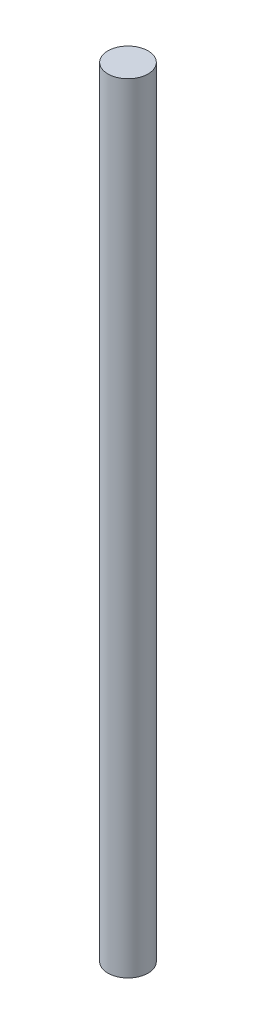
ISO-10303-21;
HEADER;
FILE_DESCRIPTION(('STEP AP214'),'2;1');
FILE_NAME('part.step','',(''),(''),'','','');
FILE_SCHEMA(('AUTOMOTIVE_DESIGN { 1 0 10303 214 1 1 1 1 }'));
ENDSEC;
DATA;
#1=APPLICATION_CONTEXT('core data for automotive mechanical design processes');
#2=APPLICATION_PROTOCOL_DEFINITION('international standard','automotive_design',2000,#1);
#3=PRODUCT_CONTEXT('',#1,'mechanical');
#4=PRODUCT('Part','Part','',(#3));
#5=PRODUCT_RELATED_PRODUCT_CATEGORY('part','',(#4));
#6=PRODUCT_DEFINITION_FORMATION('','',#4);
#7=PRODUCT_DEFINITION_CONTEXT('part definition',#1,'design');
#8=PRODUCT_DEFINITION('design','',#6,#7);
#9=PRODUCT_DEFINITION_SHAPE('','',#8);
#10=(LENGTH_UNIT() NAMED_UNIT(*) SI_UNIT(.MILLI.,.METRE.));
#11=(NAMED_UNIT(*) PLANE_ANGLE_UNIT() SI_UNIT($,.RADIAN.));
#12=(NAMED_UNIT(*) SI_UNIT($,.STERADIAN.) SOLID_ANGLE_UNIT());
#13=UNCERTAINTY_MEASURE_WITH_UNIT(LENGTH_MEASURE(1.E-05),#10,'distance_accuracy_value','');
#14=(GEOMETRIC_REPRESENTATION_CONTEXT(3) GLOBAL_UNCERTAINTY_ASSIGNED_CONTEXT((#13)) GLOBAL_UNIT_ASSIGNED_CONTEXT((#10,
#11,#12)) REPRESENTATION_CONTEXT('',''));
#15=CARTESIAN_POINT('',(0.,0.,0.));
#16=DIRECTION('',(0.,0.,1.));
#17=DIRECTION('',(1.,0.,0.));
#18=AXIS2_PLACEMENT_3D('',#15,#16,#17);
#19=CARTESIAN_POINT('',(0.,262.,0.));
#20=DIRECTION('',(0.,-1.,0.));
#21=DIRECTION('',(0.,0.,-1.));
#22=AXIS2_PLACEMENT_3D('',#19,#20,#21);
#23=CYLINDRICAL_SURFACE('',#22,6.75);
#24=CARTESIAN_POINT('',(0.,262.,0.));
#25=DIRECTION('',(0.,1.,0.));
#26=DIRECTION('',(0.,0.,1.));
#27=AXIS2_PLACEMENT_3D('',#24,#25,#26);
#28=CIRCLE('',#27,6.75);
#29=CARTESIAN_POINT('',(0.,262.,6.75));
#30=VERTEX_POINT('',#29);
#31=EDGE_CURVE('E10',#30,#30,#28,.T.);
#32=ORIENTED_EDGE('',*,*,#31,.F.);
#33=EDGE_LOOP('',(#32));
#34=FACE_BOUND('',#33,.T.);
#35=CARTESIAN_POINT('',(0.,0.,0.));
#36=DIRECTION('',(0.,1.,0.));
#37=DIRECTION('',(0.,0.,1.));
#38=AXIS2_PLACEMENT_3D('',#35,#36,#37);
#39=CIRCLE('',#38,6.75);
#40=CARTESIAN_POINT('',(0.,0.,6.75));
#41=VERTEX_POINT('',#40);
#42=EDGE_CURVE('E40',#41,#41,#39,.T.);
#43=ORIENTED_EDGE('',*,*,#42,.T.);
#44=EDGE_LOOP('',(#43));
#45=FACE_BOUND('',#44,.T.);
#46=ADVANCED_FACE('F37',(#34,#45),#23,.T.);
#47=CARTESIAN_POINT('',(0.,262.,0.));
#48=DIRECTION('',(0.,1.,0.));
#49=DIRECTION('',(0.,0.,1.));
#50=AXIS2_PLACEMENT_3D('',#47,#48,#49);
#51=PLANE('',#50);
#52=ORIENTED_EDGE('',*,*,#31,.T.);
#53=EDGE_LOOP('',(#52));
#54=FACE_BOUND('',#53,.T.);
#55=ADVANCED_FACE('F54',(#54),#51,.T.);
#56=CARTESIAN_POINT('',(0.,0.,0.));
#57=DIRECTION('',(0.,1.,0.));
#58=DIRECTION('',(0.,0.,1.));
#59=AXIS2_PLACEMENT_3D('',#56,#57,#58);
#60=PLANE('',#59);
#61=ORIENTED_EDGE('',*,*,#42,.F.);
#62=EDGE_LOOP('',(#61));
#63=FACE_BOUND('',#62,.T.);
#64=ADVANCED_FACE('F52',(#63),#60,.F.);
#65=CLOSED_SHELL('',(#46,#55,#64));
#66=MANIFOLD_SOLID_BREP('B2',#65);
#67=ADVANCED_BREP_SHAPE_REPRESENTATION('',(#18,#66),#14);
#68=SHAPE_DEFINITION_REPRESENTATION(#9,#67);
ENDSEC;
END-ISO-10303-21;
